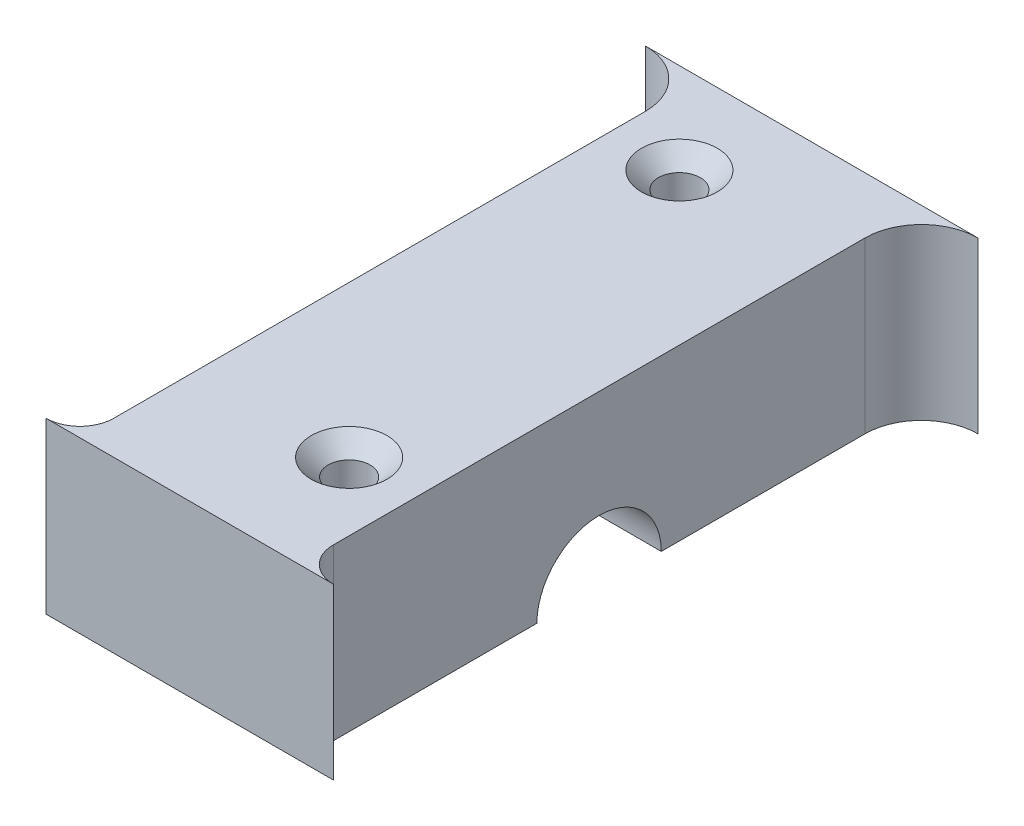
ISO-10303-21;
HEADER;
FILE_DESCRIPTION(('STEP AP214'),'2;1');
FILE_NAME('part.step','',(''),(''),'','','');
FILE_SCHEMA(('AUTOMOTIVE_DESIGN { 1 0 10303 214 1 1 1 1 }'));
ENDSEC;
DATA;
#1=APPLICATION_CONTEXT('core data for automotive mechanical design processes');
#2=APPLICATION_PROTOCOL_DEFINITION('international standard','automotive_design',2000,#1);
#3=PRODUCT_CONTEXT('',#1,'mechanical');
#4=PRODUCT('Part','Part','',(#3));
#5=PRODUCT_RELATED_PRODUCT_CATEGORY('part','',(#4));
#6=PRODUCT_DEFINITION_FORMATION('','',#4);
#7=PRODUCT_DEFINITION_CONTEXT('part definition',#1,'design');
#8=PRODUCT_DEFINITION('design','',#6,#7);
#9=PRODUCT_DEFINITION_SHAPE('','',#8);
#10=(LENGTH_UNIT() NAMED_UNIT(*) SI_UNIT(.MILLI.,.METRE.));
#11=(NAMED_UNIT(*) PLANE_ANGLE_UNIT() SI_UNIT($,.RADIAN.));
#12=(NAMED_UNIT(*) SI_UNIT($,.STERADIAN.) SOLID_ANGLE_UNIT());
#13=UNCERTAINTY_MEASURE_WITH_UNIT(LENGTH_MEASURE(1.E-05),#10,'distance_accuracy_value','');
#14=(GEOMETRIC_REPRESENTATION_CONTEXT(3) GLOBAL_UNCERTAINTY_ASSIGNED_CONTEXT((#13)) GLOBAL_UNIT_ASSIGNED_CONTEXT((#10,
#11,#12)) REPRESENTATION_CONTEXT('',''));
#15=CARTESIAN_POINT('',(0.,0.,0.));
#16=DIRECTION('',(0.,0.,1.));
#17=DIRECTION('',(1.,0.,0.));
#18=AXIS2_PLACEMENT_3D('',#15,#16,#17);
#19=CARTESIAN_POINT('',(-2.00000000000001,0.,-26.5));
#20=DIRECTION('',(1.,0.,0.));
#21=DIRECTION('',(0.,0.,-1.));
#22=AXIS2_PLACEMENT_3D('',#19,#20,#21);
#23=CYLINDRICAL_SURFACE('',#22,5.5);
#24=CARTESIAN_POINT('',(10.7,0.,-26.5));
#25=DIRECTION('',(1.,0.,0.));
#26=DIRECTION('',(0.,0.,-1.));
#27=AXIS2_PLACEMENT_3D('',#24,#25,#26);
#28=CIRCLE('',#27,5.5);
#29=CARTESIAN_POINT('',(10.7,0.,-21.));
#30=VERTEX_POINT('',#29);
#31=CARTESIAN_POINT('',(10.7,0.,-32.));
#32=VERTEX_POINT('',#31);
#33=EDGE_CURVE('E137',#30,#32,#28,.F.);
#34=ORIENTED_EDGE('',*,*,#33,.F.);
#35=DIRECTION('',(1.,0.,0.));
#36=VECTOR('',#35,1.);
#37=CARTESIAN_POINT('',(-2.00000000000001,0.,-21.));
#38=LINE('',#37,#36);
#39=CARTESIAN_POINT('',(3.,0.,-21.));
#40=VERTEX_POINT('',#39);
#41=EDGE_CURVE('E214',#40,#30,#38,.T.);
#42=ORIENTED_EDGE('',*,*,#41,.F.);
#43=CARTESIAN_POINT('',(3.,0.,-26.5));
#44=DIRECTION('',(1.,0.,0.));
#45=DIRECTION('',(0.,0.,-1.));
#46=AXIS2_PLACEMENT_3D('',#43,#44,#45);
#47=CIRCLE('',#46,5.5);
#48=CARTESIAN_POINT('',(3.,0.,-32.));
#49=VERTEX_POINT('',#48);
#50=EDGE_CURVE('E233',#49,#40,#47,.T.);
#51=ORIENTED_EDGE('',*,*,#50,.F.);
#52=DIRECTION('',(1.,0.,0.));
#53=VECTOR('',#52,1.);
#54=CARTESIAN_POINT('',(-2.00000000000001,0.,-32.));
#55=LINE('',#54,#53);
#56=EDGE_CURVE('E55',#32,#49,#55,.F.);
#57=ORIENTED_EDGE('',*,*,#56,.F.);
#58=EDGE_LOOP('',(#34,#42,#51,#57));
#59=FACE_BOUND('',#58,.T.);
#60=ADVANCED_FACE('F32',(#59),#23,.F.);
#61=CARTESIAN_POINT('',(0.,0.,-3.));
#62=DIRECTION('',(0.,1.,0.));
#63=DIRECTION('',(0.,0.,1.));
#64=AXIS2_PLACEMENT_3D('',#61,#62,#63);
#65=PLANE('',#64);
#66=CARTESIAN_POINT('',(16.4,0.,-10.4));
#67=DIRECTION('',(0.,-1.,0.));
#68=DIRECTION('',(0.,0.,-1.));
#69=AXIS2_PLACEMENT_3D('',#66,#67,#68);
#70=CIRCLE('',#69,1.85);
#71=CARTESIAN_POINT('',(16.4,0.,-12.25));
#72=VERTEX_POINT('',#71);
#73=EDGE_CURVE('E148',#72,#72,#70,.T.);
#74=ORIENTED_EDGE('',*,*,#73,.F.);
#75=EDGE_LOOP('',(#74));
#76=FACE_BOUND('',#75,.T.);
#77=DIRECTION('',(-1.,0.,0.));
#78=VECTOR('',#77,1.);
#79=CARTESIAN_POINT('',(14.7,0.,-15.));
#80=LINE('',#79,#78);
#81=CARTESIAN_POINT('',(14.7,0.,-15.));
#82=VERTEX_POINT('',#81);
#83=CARTESIAN_POINT('',(10.7,0.,-15.));
#84=VERTEX_POINT('',#83);
#85=EDGE_CURVE('E147',#82,#84,#80,.T.);
#86=ORIENTED_EDGE('',*,*,#85,.F.);
#87=DIRECTION('',(0.,0.,-1.));
#88=VECTOR('',#87,1.);
#89=CARTESIAN_POINT('',(14.7,0.,-3.));
#90=LINE('',#89,#88);
#91=CARTESIAN_POINT('',(14.7,0.,-21.));
#92=VERTEX_POINT('',#91);
#93=EDGE_CURVE('E226',#82,#92,#90,.T.);
#94=ORIENTED_EDGE('',*,*,#93,.T.);
#95=CARTESIAN_POINT('',(22.4,0.,-21.));
#96=VERTEX_POINT('',#95);
#97=EDGE_CURVE('E213',#92,#96,#38,.T.);
#98=ORIENTED_EDGE('',*,*,#97,.T.);
#99=DIRECTION('',(0.,0.,-1.));
#100=VECTOR('',#99,1.);
#101=CARTESIAN_POINT('',(22.4,0.,-50.));
#102=LINE('',#101,#100);
#103=CARTESIAN_POINT('',(22.4,0.,-3.));
#104=VERTEX_POINT('',#103);
#105=EDGE_CURVE('E225',#104,#96,#102,.T.);
#106=ORIENTED_EDGE('',*,*,#105,.F.);
#107=CARTESIAN_POINT('',(25.4,0.,-3.));
#108=DIRECTION('',(0.,-1.,0.));
#109=DIRECTION('',(0.,0.,-1.));
#110=AXIS2_PLACEMENT_3D('',#107,#108,#109);
#111=CIRCLE('',#110,3.);
#112=CARTESIAN_POINT('',(25.4,0.,0.));
#113=VERTEX_POINT('',#112);
#114=EDGE_CURVE('E244',#113,#104,#111,.T.);
#115=ORIENTED_EDGE('',*,*,#114,.F.);
#116=DIRECTION('',(1.,0.,0.));
#117=VECTOR('',#116,1.);
#118=CARTESIAN_POINT('',(0.,0.,0.));
#119=LINE('',#118,#117);
#120=CARTESIAN_POINT('',(0.,0.,0.));
#121=VERTEX_POINT('',#120);
#122=EDGE_CURVE('E291',#121,#113,#119,.T.);
#123=ORIENTED_EDGE('',*,*,#122,.F.);
#124=CARTESIAN_POINT('',(0.,0.,-3.));
#125=DIRECTION('',(0.,-1.,0.));
#126=DIRECTION('',(0.,0.,1.));
#127=AXIS2_PLACEMENT_3D('',#124,#125,#126);
#128=CIRCLE('',#127,3.);
#129=CARTESIAN_POINT('',(3.,0.,-3.));
#130=VERTEX_POINT('',#129);
#131=EDGE_CURVE('E202',#130,#121,#128,.T.);
#132=ORIENTED_EDGE('',*,*,#131,.F.);
#133=DIRECTION('',(0.,0.,1.));
#134=VECTOR('',#133,1.);
#135=CARTESIAN_POINT('',(2.99999999999999,0.,-50.));
#136=LINE('',#135,#134);
#137=EDGE_CURVE('E251',#40,#130,#136,.T.);
#138=ORIENTED_EDGE('',*,*,#137,.F.);
#139=ORIENTED_EDGE('',*,*,#41,.T.);
#140=DIRECTION('',(0.,0.,-1.));
#141=VECTOR('',#140,1.);
#142=CARTESIAN_POINT('',(10.7,0.,-3.));
#143=LINE('',#142,#141);
#144=EDGE_CURVE('E47',#84,#30,#143,.T.);
#145=ORIENTED_EDGE('',*,*,#144,.F.);
#146=EDGE_LOOP('',(#86,#94,#98,#106,#115,#123,#132,#138,#139,#145));
#147=FACE_BOUND('',#146,.T.);
#148=ADVANCED_FACE('F222',(#76,#147),#65,.F.);
#149=CARTESIAN_POINT('',(0.,15.,-3.));
#150=DIRECTION('',(0.,-1.,0.));
#151=DIRECTION('',(0.,0.,-1.));
#152=AXIS2_PLACEMENT_3D('',#149,#150,#151);
#153=CYLINDRICAL_SURFACE('',#152,3.);
#154=ORIENTED_EDGE('',*,*,#131,.T.);
#155=DIRECTION('',(0.,-1.,0.));
#156=VECTOR('',#155,1.);
#157=CARTESIAN_POINT('',(0.,15.,0.));
#158=LINE('',#157,#156);
#159=CARTESIAN_POINT('',(0.,15.,0.));
#160=VERTEX_POINT('',#159);
#161=EDGE_CURVE('E199',#160,#121,#158,.T.);
#162=ORIENTED_EDGE('',*,*,#161,.F.);
#163=CARTESIAN_POINT('',(0.,15.,-3.));
#164=DIRECTION('',(0.,-1.,0.));
#165=DIRECTION('',(0.,0.,1.));
#166=AXIS2_PLACEMENT_3D('',#163,#164,#165);
#167=CIRCLE('',#166,3.);
#168=CARTESIAN_POINT('',(3.,15.,-3.));
#169=VERTEX_POINT('',#168);
#170=EDGE_CURVE('E186',#169,#160,#167,.T.);
#171=ORIENTED_EDGE('',*,*,#170,.F.);
#172=DIRECTION('',(0.,-1.,0.));
#173=VECTOR('',#172,1.);
#174=CARTESIAN_POINT('',(3.,15.,-3.));
#175=LINE('',#174,#173);
#176=EDGE_CURVE('E254',#169,#130,#175,.T.);
#177=ORIENTED_EDGE('',*,*,#176,.T.);
#178=EDGE_LOOP('',(#154,#162,#171,#177));
#179=FACE_BOUND('',#178,.T.);
#180=ADVANCED_FACE('F200',(#179),#153,.F.);
#181=CARTESIAN_POINT('',(0.,15.,0.));
#182=DIRECTION('',(0.,0.,-1.));
#183=DIRECTION('',(-1.,0.,0.));
#184=AXIS2_PLACEMENT_3D('',#181,#182,#183);
#185=PLANE('',#184);
#186=ORIENTED_EDGE('',*,*,#122,.T.);
#187=DIRECTION('',(0.,-1.,0.));
#188=VECTOR('',#187,1.);
#189=CARTESIAN_POINT('',(25.4,15.,0.));
#190=LINE('',#189,#188);
#191=CARTESIAN_POINT('',(25.4,15.,0.));
#192=VERTEX_POINT('',#191);
#193=EDGE_CURVE('E204',#192,#113,#190,.T.);
#194=ORIENTED_EDGE('',*,*,#193,.F.);
#195=DIRECTION('',(1.,0.,0.));
#196=VECTOR('',#195,1.);
#197=CARTESIAN_POINT('',(0.,15.,0.));
#198=LINE('',#197,#196);
#199=EDGE_CURVE('E188',#160,#192,#198,.T.);
#200=ORIENTED_EDGE('',*,*,#199,.F.);
#201=ORIENTED_EDGE('',*,*,#161,.T.);
#202=EDGE_LOOP('',(#186,#194,#200,#201));
#203=FACE_BOUND('',#202,.T.);
#204=ADVANCED_FACE('F323',(#203),#185,.F.);
#205=CARTESIAN_POINT('',(25.4,15.,-3.));
#206=DIRECTION('',(0.,-1.,0.));
#207=DIRECTION('',(0.,0.,-1.));
#208=AXIS2_PLACEMENT_3D('',#205,#206,#207);
#209=CYLINDRICAL_SURFACE('',#208,3.);
#210=ORIENTED_EDGE('',*,*,#114,.T.);
#211=DIRECTION('',(0.,-1.,0.));
#212=VECTOR('',#211,1.);
#213=CARTESIAN_POINT('',(22.4,15.,-3.));
#214=LINE('',#213,#212);
#215=CARTESIAN_POINT('',(22.4,15.,-3.));
#216=VERTEX_POINT('',#215);
#217=EDGE_CURVE('E209',#216,#104,#214,.T.);
#218=ORIENTED_EDGE('',*,*,#217,.F.);
#219=CARTESIAN_POINT('',(25.4,15.,-3.));
#220=DIRECTION('',(0.,-1.,0.));
#221=DIRECTION('',(0.,0.,-1.));
#222=AXIS2_PLACEMENT_3D('',#219,#220,#221);
#223=CIRCLE('',#222,3.);
#224=EDGE_CURVE('E303',#192,#216,#223,.T.);
#225=ORIENTED_EDGE('',*,*,#224,.F.);
#226=ORIENTED_EDGE('',*,*,#193,.T.);
#227=EDGE_LOOP('',(#210,#218,#225,#226));
#228=FACE_BOUND('',#227,.T.);
#229=ADVANCED_FACE('F293',(#228),#209,.F.);
#230=CARTESIAN_POINT('',(22.4,15.,-50.));
#231=DIRECTION('',(-1.,0.,0.));
#232=DIRECTION('',(0.,0.,1.));
#233=AXIS2_PLACEMENT_3D('',#230,#231,#232);
#234=PLANE('',#233);
#235=ORIENTED_EDGE('',*,*,#105,.T.);
#236=CARTESIAN_POINT('',(22.4,0.,-26.5));
#237=DIRECTION('',(-1.,0.,0.));
#238=DIRECTION('',(0.,0.,1.));
#239=AXIS2_PLACEMENT_3D('',#236,#237,#238);
#240=CIRCLE('',#239,5.5);
#241=CARTESIAN_POINT('',(22.4,0.,-32.));
#242=VERTEX_POINT('',#241);
#243=EDGE_CURVE('E229',#96,#242,#240,.T.);
#244=ORIENTED_EDGE('',*,*,#243,.T.);
#245=CARTESIAN_POINT('',(22.4,0.,-50.));
#246=VERTEX_POINT('',#245);
#247=EDGE_CURVE('E240',#242,#246,#102,.T.);
#248=ORIENTED_EDGE('',*,*,#247,.T.);
#249=DIRECTION('',(0.,-1.,0.));
#250=VECTOR('',#249,1.);
#251=CARTESIAN_POINT('',(22.4,15.,-50.));
#252=LINE('',#251,#250);
#253=CARTESIAN_POINT('',(22.4,15.,-50.));
#254=VERTEX_POINT('',#253);
#255=EDGE_CURVE('E265',#254,#246,#252,.T.);
#256=ORIENTED_EDGE('',*,*,#255,.F.);
#257=DIRECTION('',(0.,0.,-1.));
#258=VECTOR('',#257,1.);
#259=CARTESIAN_POINT('',(22.4,15.,-50.));
#260=LINE('',#259,#258);
#261=EDGE_CURVE('E305',#216,#254,#260,.T.);
#262=ORIENTED_EDGE('',*,*,#261,.F.);
#263=ORIENTED_EDGE('',*,*,#217,.T.);
#264=EDGE_LOOP('',(#235,#244,#248,#256,#262,#263));
#265=FACE_BOUND('',#264,.T.);
#266=ADVANCED_FACE('F236',(#265),#234,.F.);
#267=CARTESIAN_POINT('',(27.4,15.,-50.));
#268=DIRECTION('',(0.,-1.,0.));
#269=DIRECTION('',(0.,0.,-1.));
#270=AXIS2_PLACEMENT_3D('',#267,#268,#269);
#271=CYLINDRICAL_SURFACE('',#270,5.);
#272=CARTESIAN_POINT('',(27.4,0.,-50.));
#273=DIRECTION('',(0.,-1.,0.));
#274=DIRECTION('',(0.,0.,1.));
#275=AXIS2_PLACEMENT_3D('',#272,#273,#274);
#276=CIRCLE('',#275,5.);
#277=CARTESIAN_POINT('',(27.4,0.,-55.));
#278=VERTEX_POINT('',#277);
#279=EDGE_CURVE('E239',#246,#278,#276,.T.);
#280=ORIENTED_EDGE('',*,*,#279,.T.);
#281=DIRECTION('',(0.,-1.,0.));
#282=VECTOR('',#281,1.);
#283=CARTESIAN_POINT('',(27.4,15.,-55.));
#284=LINE('',#283,#282);
#285=CARTESIAN_POINT('',(27.4,15.,-55.));
#286=VERTEX_POINT('',#285);
#287=EDGE_CURVE('E262',#286,#278,#284,.T.);
#288=ORIENTED_EDGE('',*,*,#287,.F.);
#289=CARTESIAN_POINT('',(27.4,15.,-50.));
#290=DIRECTION('',(0.,-1.,0.));
#291=DIRECTION('',(0.,0.,1.));
#292=AXIS2_PLACEMENT_3D('',#289,#290,#291);
#293=CIRCLE('',#292,5.);
#294=EDGE_CURVE('E273',#254,#286,#293,.T.);
#295=ORIENTED_EDGE('',*,*,#294,.F.);
#296=ORIENTED_EDGE('',*,*,#255,.T.);
#297=EDGE_LOOP('',(#280,#288,#295,#296));
#298=FACE_BOUND('',#297,.T.);
#299=ADVANCED_FACE('F271',(#298),#271,.F.);
#300=CARTESIAN_POINT('',(27.4,15.,-55.));
#301=DIRECTION('',(0.,0.,1.));
#302=DIRECTION('',(1.,0.,0.));
#303=AXIS2_PLACEMENT_3D('',#300,#301,#302);
#304=PLANE('',#303);
#305=DIRECTION('',(-1.,0.,0.));
#306=VECTOR('',#305,1.);
#307=CARTESIAN_POINT('',(27.4,0.,-55.));
#308=LINE('',#307,#306);
#309=CARTESIAN_POINT('',(-2.00000000000001,0.,-55.));
#310=VERTEX_POINT('',#309);
#311=EDGE_CURVE('E242',#278,#310,#308,.T.);
#312=ORIENTED_EDGE('',*,*,#311,.T.);
#313=DIRECTION('',(0.,-1.,0.));
#314=VECTOR('',#313,1.);
#315=CARTESIAN_POINT('',(-2.00000000000001,15.,-55.));
#316=LINE('',#315,#314);
#317=CARTESIAN_POINT('',(-2.00000000000001,15.,-55.));
#318=VERTEX_POINT('',#317);
#319=EDGE_CURVE('E259',#318,#310,#316,.T.);
#320=ORIENTED_EDGE('',*,*,#319,.F.);
#321=DIRECTION('',(-1.,0.,0.));
#322=VECTOR('',#321,1.);
#323=CARTESIAN_POINT('',(27.4,15.,-55.));
#324=LINE('',#323,#322);
#325=EDGE_CURVE('E285',#286,#318,#324,.T.);
#326=ORIENTED_EDGE('',*,*,#325,.F.);
#327=ORIENTED_EDGE('',*,*,#287,.T.);
#328=EDGE_LOOP('',(#312,#320,#326,#327));
#329=FACE_BOUND('',#328,.T.);
#330=ADVANCED_FACE('F278',(#329),#304,.F.);
#331=CARTESIAN_POINT('',(-2.,15.,-50.));
#332=DIRECTION('',(0.,-1.,0.));
#333=DIRECTION('',(0.,0.,-1.));
#334=AXIS2_PLACEMENT_3D('',#331,#332,#333);
#335=CYLINDRICAL_SURFACE('',#334,5.);
#336=CARTESIAN_POINT('',(-2.,0.,-50.));
#337=DIRECTION('',(0.,-1.,0.));
#338=DIRECTION('',(0.,0.,-1.));
#339=AXIS2_PLACEMENT_3D('',#336,#337,#338);
#340=CIRCLE('',#339,5.);
#341=CARTESIAN_POINT('',(2.99999999999999,0.,-50.));
#342=VERTEX_POINT('',#341);
#343=EDGE_CURVE('E249',#310,#342,#340,.T.);
#344=ORIENTED_EDGE('',*,*,#343,.T.);
#345=DIRECTION('',(0.,-1.,0.));
#346=VECTOR('',#345,1.);
#347=CARTESIAN_POINT('',(2.99999999999999,15.,-50.));
#348=LINE('',#347,#346);
#349=CARTESIAN_POINT('',(2.99999999999999,15.,-50.));
#350=VERTEX_POINT('',#349);
#351=EDGE_CURVE('E256',#350,#342,#348,.T.);
#352=ORIENTED_EDGE('',*,*,#351,.F.);
#353=CARTESIAN_POINT('',(-2.,15.,-50.));
#354=DIRECTION('',(0.,-1.,0.));
#355=DIRECTION('',(0.,0.,-1.));
#356=AXIS2_PLACEMENT_3D('',#353,#354,#355);
#357=CIRCLE('',#356,5.);
#358=EDGE_CURVE('E284',#318,#350,#357,.T.);
#359=ORIENTED_EDGE('',*,*,#358,.F.);
#360=ORIENTED_EDGE('',*,*,#319,.T.);
#361=EDGE_LOOP('',(#344,#352,#359,#360));
#362=FACE_BOUND('',#361,.T.);
#363=ADVANCED_FACE('F282',(#362),#335,.F.);
#364=CARTESIAN_POINT('',(2.99999999999999,15.,-50.));
#365=DIRECTION('',(1.,0.,0.));
#366=DIRECTION('',(0.,0.,-1.));
#367=AXIS2_PLACEMENT_3D('',#364,#365,#366);
#368=PLANE('',#367);
#369=EDGE_CURVE('E195',#342,#49,#136,.T.);
#370=ORIENTED_EDGE('',*,*,#369,.T.);
#371=ORIENTED_EDGE('',*,*,#50,.T.);
#372=ORIENTED_EDGE('',*,*,#137,.T.);
#373=ORIENTED_EDGE('',*,*,#176,.F.);
#374=DIRECTION('',(0.,0.,1.));
#375=VECTOR('',#374,1.);
#376=CARTESIAN_POINT('',(2.99999999999999,15.,-50.));
#377=LINE('',#376,#375);
#378=EDGE_CURVE('E191',#350,#169,#377,.T.);
#379=ORIENTED_EDGE('',*,*,#378,.F.);
#380=ORIENTED_EDGE('',*,*,#351,.T.);
#381=EDGE_LOOP('',(#370,#371,#372,#373,#379,#380));
#382=FACE_BOUND('',#381,.T.);
#383=ADVANCED_FACE('F180',(#382),#368,.F.);
#384=CARTESIAN_POINT('',(0.,15.,-3.));
#385=DIRECTION('',(0.,1.,0.));
#386=DIRECTION('',(0.,0.,1.));
#387=AXIS2_PLACEMENT_3D('',#384,#385,#386);
#388=PLANE('',#387);
#389=CARTESIAN_POINT('',(8.99999999999999,15.,-47.));
#390=DIRECTION('',(0.,1.,0.));
#391=DIRECTION('',(0.,0.,1.));
#392=AXIS2_PLACEMENT_3D('',#389,#390,#391);
#393=CIRCLE('',#392,3.34999999999999);
#394=CARTESIAN_POINT('',(8.99999999999999,15.,-43.65));
#395=VERTEX_POINT('',#394);
#396=EDGE_CURVE('E158',#395,#395,#393,.F.);
#397=ORIENTED_EDGE('',*,*,#396,.T.);
#398=EDGE_LOOP('',(#397));
#399=FACE_BOUND('',#398,.T.);
#400=CARTESIAN_POINT('',(16.4,15.,-10.4));
#401=DIRECTION('',(0.,1.,0.));
#402=DIRECTION('',(0.,0.,1.));
#403=AXIS2_PLACEMENT_3D('',#400,#401,#402);
#404=CIRCLE('',#403,3.35);
#405=CARTESIAN_POINT('',(16.4,15.,-7.05));
#406=VERTEX_POINT('',#405);
#407=EDGE_CURVE('E154',#406,#406,#404,.F.);
#408=ORIENTED_EDGE('',*,*,#407,.T.);
#409=EDGE_LOOP('',(#408));
#410=FACE_BOUND('',#409,.T.);
#411=ORIENTED_EDGE('',*,*,#170,.T.);
#412=ORIENTED_EDGE('',*,*,#199,.T.);
#413=ORIENTED_EDGE('',*,*,#224,.T.);
#414=ORIENTED_EDGE('',*,*,#261,.T.);
#415=ORIENTED_EDGE('',*,*,#294,.T.);
#416=ORIENTED_EDGE('',*,*,#325,.T.);
#417=ORIENTED_EDGE('',*,*,#358,.T.);
#418=ORIENTED_EDGE('',*,*,#378,.T.);
#419=EDGE_LOOP('',(#411,#412,#413,#414,#415,#416,#417,#418));
#420=FACE_BOUND('',#419,.T.);
#421=ADVANCED_FACE('F177',(#399,#410,#420),#388,.T.);
#422=CARTESIAN_POINT('',(8.99999999999999,0.,-47.));
#423=DIRECTION('',(0.,-1.,0.));
#424=DIRECTION('',(0.,0.,-1.));
#425=AXIS2_PLACEMENT_3D('',#422,#423,#424);
#426=CIRCLE('',#425,1.85);
#427=CARTESIAN_POINT('',(8.99999999999999,0.,-48.85));
#428=VERTEX_POINT('',#427);
#429=EDGE_CURVE('E310',#428,#428,#426,.T.);
#430=ORIENTED_EDGE('',*,*,#429,.F.);
#431=EDGE_LOOP('',(#430));
#432=FACE_BOUND('',#431,.T.);
#433=CARTESIAN_POINT('',(14.7,0.,-32.));
#434=VERTEX_POINT('',#433);
#435=EDGE_CURVE('E206',#242,#434,#55,.F.);
#436=ORIENTED_EDGE('',*,*,#435,.T.);
#437=DIRECTION('',(0.,0.,-1.));
#438=VECTOR('',#437,1.);
#439=CARTESIAN_POINT('',(14.7,0.,-3.));
#440=LINE('',#439,#438);
#441=CARTESIAN_POINT('',(14.7,0.,-38.));
#442=VERTEX_POINT('',#441);
#443=EDGE_CURVE('E153',#434,#442,#440,.T.);
#444=ORIENTED_EDGE('',*,*,#443,.T.);
#445=DIRECTION('',(-1.,0.,0.));
#446=VECTOR('',#445,1.);
#447=CARTESIAN_POINT('',(14.7,0.,-38.));
#448=LINE('',#447,#446);
#449=CARTESIAN_POINT('',(10.7,0.,-38.));
#450=VERTEX_POINT('',#449);
#451=EDGE_CURVE('E144',#450,#442,#448,.F.);
#452=ORIENTED_EDGE('',*,*,#451,.F.);
#453=DIRECTION('',(0.,0.,-1.));
#454=VECTOR('',#453,1.);
#455=CARTESIAN_POINT('',(10.7,0.,-3.));
#456=LINE('',#455,#454);
#457=EDGE_CURVE('E133',#32,#450,#456,.T.);
#458=ORIENTED_EDGE('',*,*,#457,.F.);
#459=ORIENTED_EDGE('',*,*,#56,.T.);
#460=ORIENTED_EDGE('',*,*,#369,.F.);
#461=ORIENTED_EDGE('',*,*,#343,.F.);
#462=ORIENTED_EDGE('',*,*,#311,.F.);
#463=ORIENTED_EDGE('',*,*,#279,.F.);
#464=ORIENTED_EDGE('',*,*,#247,.F.);
#465=EDGE_LOOP('',(#436,#444,#452,#458,#459,#460,#461,#462,#463,#464));
#466=FACE_BOUND('',#465,.T.);
#467=ADVANCED_FACE('F152',(#432,#466),#65,.F.);
#468=ORIENTED_EDGE('',*,*,#97,.F.);
#469=CARTESIAN_POINT('',(14.7,0.,-26.5));
#470=DIRECTION('',(1.,0.,0.));
#471=DIRECTION('',(0.,0.,-1.));
#472=AXIS2_PLACEMENT_3D('',#469,#470,#471);
#473=CIRCLE('',#472,5.5);
#474=EDGE_CURVE('E155',#92,#434,#473,.F.);
#475=ORIENTED_EDGE('',*,*,#474,.T.);
#476=ORIENTED_EDGE('',*,*,#435,.F.);
#477=ORIENTED_EDGE('',*,*,#243,.F.);
#478=EDGE_LOOP('',(#468,#475,#476,#477));
#479=FACE_BOUND('',#478,.T.);
#480=ADVANCED_FACE('F230',(#479),#23,.F.);
#481=CARTESIAN_POINT('',(14.7,0.,-26.5));
#482=DIRECTION('',(-1.,0.,0.));
#483=DIRECTION('',(0.,0.,1.));
#484=AXIS2_PLACEMENT_3D('',#481,#482,#483);
#485=CYLINDRICAL_SURFACE('',#484,11.5);
#486=ORIENTED_EDGE('',*,*,#85,.T.);
#487=CARTESIAN_POINT('',(10.7,0.,-26.5));
#488=DIRECTION('',(1.,0.,0.));
#489=DIRECTION('',(0.,0.,-1.));
#490=AXIS2_PLACEMENT_3D('',#487,#488,#489);
#491=CIRCLE('',#490,11.5);
#492=EDGE_CURVE('E136',#450,#84,#491,.T.);
#493=ORIENTED_EDGE('',*,*,#492,.F.);
#494=ORIENTED_EDGE('',*,*,#451,.T.);
#495=CARTESIAN_POINT('',(14.7,0.,-26.5));
#496=DIRECTION('',(1.,0.,0.));
#497=DIRECTION('',(0.,0.,-1.));
#498=AXIS2_PLACEMENT_3D('',#495,#496,#497);
#499=CIRCLE('',#498,11.5);
#500=EDGE_CURVE('E139',#442,#82,#499,.T.);
#501=ORIENTED_EDGE('',*,*,#500,.T.);
#502=EDGE_LOOP('',(#486,#493,#494,#501));
#503=FACE_BOUND('',#502,.T.);
#504=ADVANCED_FACE('F142',(#503),#485,.F.);
#505=CARTESIAN_POINT('',(14.7,0.,-26.5));
#506=DIRECTION('',(1.,0.,0.));
#507=DIRECTION('',(0.,0.,-1.));
#508=AXIS2_PLACEMENT_3D('',#505,#506,#507);
#509=PLANE('',#508);
#510=ORIENTED_EDGE('',*,*,#500,.F.);
#511=ORIENTED_EDGE('',*,*,#443,.F.);
#512=ORIENTED_EDGE('',*,*,#474,.F.);
#513=ORIENTED_EDGE('',*,*,#93,.F.);
#514=EDGE_LOOP('',(#510,#511,#512,#513));
#515=FACE_BOUND('',#514,.T.);
#516=ADVANCED_FACE('F341',(#515),#509,.F.);
#517=CARTESIAN_POINT('',(10.7,0.,-26.5));
#518=DIRECTION('',(1.,0.,0.));
#519=DIRECTION('',(0.,0.,-1.));
#520=AXIS2_PLACEMENT_3D('',#517,#518,#519);
#521=PLANE('',#520);
#522=ORIENTED_EDGE('',*,*,#144,.T.);
#523=ORIENTED_EDGE('',*,*,#33,.T.);
#524=ORIENTED_EDGE('',*,*,#457,.T.);
#525=ORIENTED_EDGE('',*,*,#492,.T.);
#526=EDGE_LOOP('',(#522,#523,#524,#525));
#527=FACE_BOUND('',#526,.T.);
#528=ADVANCED_FACE('F135',(#527),#521,.T.);
#529=CARTESIAN_POINT('',(8.99999999999999,15.,-47.));
#530=DIRECTION('',(0.,-1.,0.));
#531=DIRECTION('',(0.,0.,-1.));
#532=AXIS2_PLACEMENT_3D('',#529,#530,#531);
#533=CYLINDRICAL_SURFACE('',#532,1.85);
#534=CARTESIAN_POINT('',(8.99999999999999,13.5,-47.));
#535=DIRECTION('',(0.,1.,0.));
#536=DIRECTION('',(0.,0.,1.));
#537=AXIS2_PLACEMENT_3D('',#534,#535,#536);
#538=CIRCLE('',#537,1.85);
#539=CARTESIAN_POINT('',(8.99999999999999,13.5,-45.15));
#540=VERTEX_POINT('',#539);
#541=EDGE_CURVE('E40',#540,#540,#538,.T.);
#542=ORIENTED_EDGE('',*,*,#541,.T.);
#543=EDGE_LOOP('',(#542));
#544=FACE_BOUND('',#543,.T.);
#545=ORIENTED_EDGE('',*,*,#429,.T.);
#546=EDGE_LOOP('',(#545));
#547=FACE_BOUND('',#546,.T.);
#548=ADVANCED_FACE('F168',(#544,#547),#533,.F.);
#549=CARTESIAN_POINT('',(16.4,15.,-10.4));
#550=DIRECTION('',(0.,-1.,0.));
#551=DIRECTION('',(0.,0.,-1.));
#552=AXIS2_PLACEMENT_3D('',#549,#550,#551);
#553=CYLINDRICAL_SURFACE('',#552,1.85);
#554=CARTESIAN_POINT('',(16.4,13.5,-10.4));
#555=DIRECTION('',(0.,1.,0.));
#556=DIRECTION('',(0.,0.,1.));
#557=AXIS2_PLACEMENT_3D('',#554,#555,#556);
#558=CIRCLE('',#557,1.85);
#559=CARTESIAN_POINT('',(16.4,13.5,-8.55));
#560=VERTEX_POINT('',#559);
#561=EDGE_CURVE('E11',#560,#560,#558,.T.);
#562=ORIENTED_EDGE('',*,*,#561,.T.);
#563=EDGE_LOOP('',(#562));
#564=FACE_BOUND('',#563,.T.);
#565=ORIENTED_EDGE('',*,*,#73,.T.);
#566=EDGE_LOOP('',(#565));
#567=FACE_BOUND('',#566,.T.);
#568=ADVANCED_FACE('F174',(#564,#567),#553,.F.);
#569=CARTESIAN_POINT('',(8.99999999999999,15.,-47.));
#570=DIRECTION('',(0.,1.,0.));
#571=DIRECTION('',(0.,0.,1.));
#572=AXIS2_PLACEMENT_3D('',#569,#570,#571);
#573=CONICAL_SURFACE('',#572,3.34999999999999,0.785398163397447);
#574=ORIENTED_EDGE('',*,*,#541,.F.);
#575=EDGE_LOOP('',(#574));
#576=FACE_BOUND('',#575,.T.);
#577=ORIENTED_EDGE('',*,*,#396,.F.);
#578=EDGE_LOOP('',(#577));
#579=FACE_BOUND('',#578,.T.);
#580=ADVANCED_FACE('F171',(#576,#579),#573,.F.);
#581=CARTESIAN_POINT('',(16.4,15.,-10.4));
#582=DIRECTION('',(0.,1.,0.));
#583=DIRECTION('',(0.,0.,1.));
#584=AXIS2_PLACEMENT_3D('',#581,#582,#583);
#585=CONICAL_SURFACE('',#584,3.35,0.785398163397448);
#586=ORIENTED_EDGE('',*,*,#561,.F.);
#587=EDGE_LOOP('',(#586));
#588=FACE_BOUND('',#587,.T.);
#589=ORIENTED_EDGE('',*,*,#407,.F.);
#590=EDGE_LOOP('',(#589));
#591=FACE_BOUND('',#590,.T.);
#592=ADVANCED_FACE('F34',(#588,#591),#585,.F.);
#593=CLOSED_SHELL('',(#60,#148,#180,#204,#229,#266,#299,#330,#363,#383,#421,#467,#480,#504,#516,
#528,#548,#568,#580,#592));
#594=MANIFOLD_SOLID_BREP('B2',#593);
#595=ADVANCED_BREP_SHAPE_REPRESENTATION('',(#18,#594),#14);
#596=SHAPE_DEFINITION_REPRESENTATION(#9,#595);
ENDSEC;
END-ISO-10303-21;
